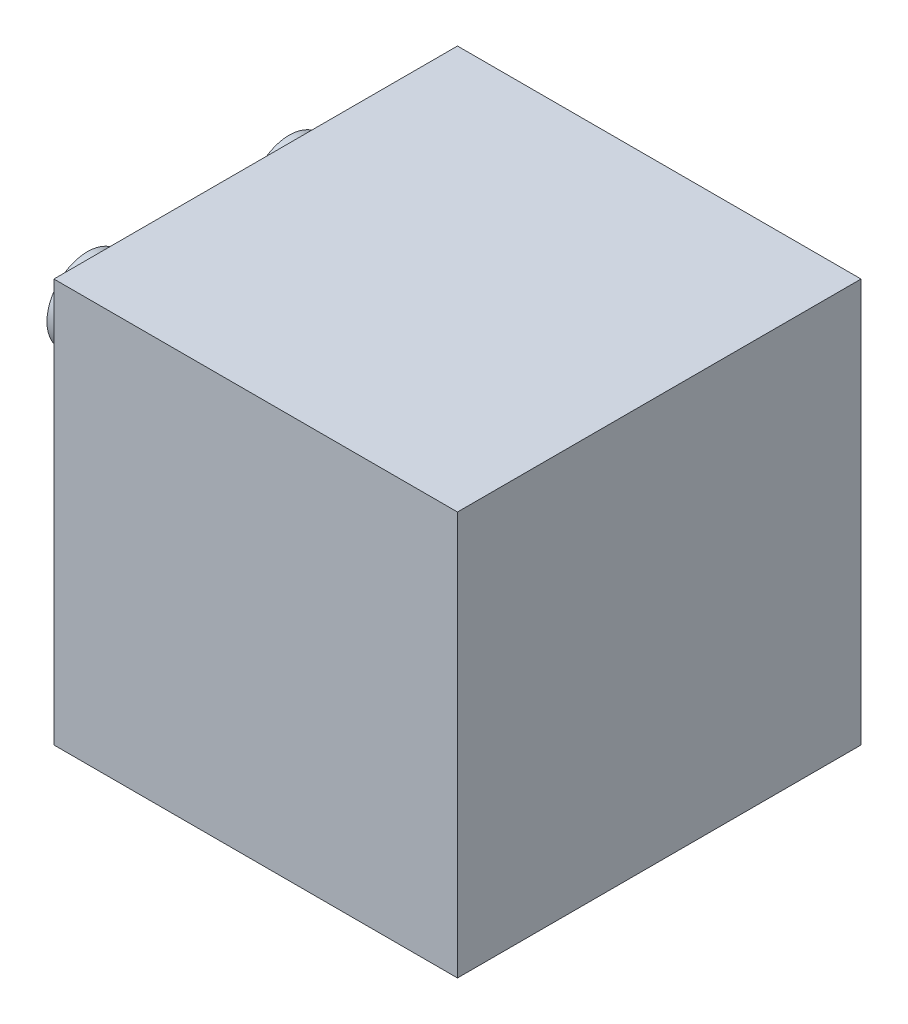
ISO-10303-21;
HEADER;
FILE_DESCRIPTION(('STEP AP214'),'2;1');
FILE_NAME('part.step','',(''),(''),'','','');
FILE_SCHEMA(('AUTOMOTIVE_DESIGN { 1 0 10303 214 1 1 1 1 }'));
ENDSEC;
DATA;
#1=APPLICATION_CONTEXT('core data for automotive mechanical design processes');
#2=APPLICATION_PROTOCOL_DEFINITION('international standard','automotive_design',2000,#1);
#3=PRODUCT_CONTEXT('',#1,'mechanical');
#4=PRODUCT('Part','Part','',(#3));
#5=PRODUCT_RELATED_PRODUCT_CATEGORY('part','',(#4));
#6=PRODUCT_DEFINITION_FORMATION('','',#4);
#7=PRODUCT_DEFINITION_CONTEXT('part definition',#1,'design');
#8=PRODUCT_DEFINITION('design','',#6,#7);
#9=PRODUCT_DEFINITION_SHAPE('','',#8);
#10=(LENGTH_UNIT() NAMED_UNIT(*) SI_UNIT(.MILLI.,.METRE.));
#11=(NAMED_UNIT(*) PLANE_ANGLE_UNIT() SI_UNIT($,.RADIAN.));
#12=(NAMED_UNIT(*) SI_UNIT($,.STERADIAN.) SOLID_ANGLE_UNIT());
#13=UNCERTAINTY_MEASURE_WITH_UNIT(LENGTH_MEASURE(1.E-05),#10,'distance_accuracy_value','');
#14=(GEOMETRIC_REPRESENTATION_CONTEXT(3) GLOBAL_UNCERTAINTY_ASSIGNED_CONTEXT((#13)) GLOBAL_UNIT_ASSIGNED_CONTEXT((#10,
#11,#12)) REPRESENTATION_CONTEXT('',''));
#15=CARTESIAN_POINT('',(0.,0.,0.));
#16=DIRECTION('',(0.,0.,1.));
#17=DIRECTION('',(1.,0.,0.));
#18=AXIS2_PLACEMENT_3D('',#15,#16,#17);
#19=CARTESIAN_POINT('',(-40.4123754328972,59.88,-7.8011231057175));
#20=DIRECTION('',(1.,0.,0.));
#21=DIRECTION('',(0.,0.,-1.));
#22=AXIS2_PLACEMENT_3D('',#19,#20,#21);
#23=PLANE('',#22);
#24=DIRECTION('',(0.,0.,-1.));
#25=VECTOR('',#24,1.);
#26=CARTESIAN_POINT('',(-40.4123754328972,35.94,20.1388768942825));
#27=LINE('',#26,#25);
#28=CARTESIAN_POINT('',(-40.4123754328972,35.94,24.1388768942825));
#29=VERTEX_POINT('',#28);
#30=CARTESIAN_POINT('',(-40.4123754328972,35.94,20.1388768942825));
#31=VERTEX_POINT('',#30);
#32=EDGE_CURVE('E202',#29,#31,#27,.T.);
#33=ORIENTED_EDGE('',*,*,#32,.F.);
#34=DIRECTION('',(0.,1.,0.));
#35=VECTOR('',#34,1.);
#36=CARTESIAN_POINT('',(-40.4123754328972,29.94,24.1388768942825));
#37=LINE('',#36,#35);
#38=CARTESIAN_POINT('',(-40.4123754328972,21.94,24.1388768942825));
#39=VERTEX_POINT('',#38);
#40=EDGE_CURVE('E212',#39,#29,#37,.T.);
#41=ORIENTED_EDGE('',*,*,#40,.F.);
#42=DIRECTION('',(0.,0.,1.));
#43=VECTOR('',#42,1.);
#44=CARTESIAN_POINT('',(-40.4123754328972,21.94,24.1388768942825));
#45=LINE('',#44,#43);
#46=CARTESIAN_POINT('',(-40.4123754328972,21.94,20.1388768942825));
#47=VERTEX_POINT('',#46);
#48=EDGE_CURVE('E221',#47,#39,#45,.T.);
#49=ORIENTED_EDGE('',*,*,#48,.F.);
#50=DIRECTION('',(0.,-1.,0.));
#51=VECTOR('',#50,1.);
#52=CARTESIAN_POINT('',(-40.4123754328972,21.94,20.1388768942825));
#53=LINE('',#52,#51);
#54=EDGE_CURVE('E83',#31,#47,#53,.T.);
#55=ORIENTED_EDGE('',*,*,#54,.F.);
#56=EDGE_LOOP('',(#33,#41,#49,#55));
#57=FACE_BOUND('',#56,.T.);
#58=CARTESIAN_POINT('',(-40.4123754328972,44.91,37.1088768942825));
#59=DIRECTION('',(1.,0.,0.));
#60=DIRECTION('',(0.,0.,-1.));
#61=AXIS2_PLACEMENT_3D('',#58,#59,#60);
#62=CIRCLE('',#61,6.);
#63=CARTESIAN_POINT('',(-40.4123754328972,44.91,31.1088768942825));
#64=VERTEX_POINT('',#63);
#65=EDGE_CURVE('E12',#64,#64,#62,.F.);
#66=ORIENTED_EDGE('',*,*,#65,.F.);
#67=EDGE_LOOP('',(#66));
#68=FACE_BOUND('',#67,.T.);
#69=CARTESIAN_POINT('',(-40.4123754328972,44.91,7.1688768942825));
#70=DIRECTION('',(1.,0.,0.));
#71=DIRECTION('',(0.,0.,-1.));
#72=AXIS2_PLACEMENT_3D('',#69,#70,#71);
#73=CIRCLE('',#72,6.);
#74=CARTESIAN_POINT('',(-40.4123754328972,44.91,1.1688768942825));
#75=VERTEX_POINT('',#74);
#76=EDGE_CURVE('E69',#75,#75,#73,.F.);
#77=ORIENTED_EDGE('',*,*,#76,.F.);
#78=EDGE_LOOP('',(#77));
#79=FACE_BOUND('',#78,.T.);
#80=DIRECTION('',(0.,0.,1.));
#81=VECTOR('',#80,1.);
#82=CARTESIAN_POINT('',(-40.4123754328972,0.,-7.8011231057175));
#83=LINE('',#82,#81);
#84=CARTESIAN_POINT('',(-40.4123754328972,0.,-7.8011231057175));
#85=VERTEX_POINT('',#84);
#86=CARTESIAN_POINT('',(-40.4123754328972,0.,52.0788768942825));
#87=VERTEX_POINT('',#86);
#88=EDGE_CURVE('E299',#85,#87,#83,.T.);
#89=ORIENTED_EDGE('',*,*,#88,.T.);
#90=DIRECTION('',(0.,-1.,0.));
#91=VECTOR('',#90,1.);
#92=CARTESIAN_POINT('',(-40.4123754328972,59.88,52.0788768942825));
#93=LINE('',#92,#91);
#94=CARTESIAN_POINT('',(-40.4123754328972,59.88,52.0788768942825));
#95=VERTEX_POINT('',#94);
#96=EDGE_CURVE('E332',#95,#87,#93,.T.);
#97=ORIENTED_EDGE('',*,*,#96,.F.);
#98=DIRECTION('',(0.,0.,1.));
#99=VECTOR('',#98,1.);
#100=CARTESIAN_POINT('',(-40.4123754328972,59.88,-7.8011231057175));
#101=LINE('',#100,#99);
#102=CARTESIAN_POINT('',(-40.4123754328972,59.88,-7.8011231057175));
#103=VERTEX_POINT('',#102);
#104=EDGE_CURVE('E306',#103,#95,#101,.T.);
#105=ORIENTED_EDGE('',*,*,#104,.F.);
#106=DIRECTION('',(0.,-1.,0.));
#107=VECTOR('',#106,1.);
#108=CARTESIAN_POINT('',(-40.4123754328972,59.88,-7.8011231057175));
#109=LINE('',#108,#107);
#110=EDGE_CURVE('E316',#103,#85,#109,.T.);
#111=ORIENTED_EDGE('',*,*,#110,.T.);
#112=EDGE_LOOP('',(#89,#97,#105,#111));
#113=FACE_BOUND('',#112,.T.);
#114=CARTESIAN_POINT('',(-40.4123754328972,15.0328473225194,11.1995581186024));
#115=CARTESIAN_POINT('',(-40.4123754328972,2.88078542754067,22.0189662727186));
#116=CARTESIAN_POINT('',(-40.4123754328972,15.0328473225194,32.6103832399784));
#117=B_SPLINE_CURVE_WITH_KNOTS('',2,(#114,#115,#116),.UNSPECIFIED.,.F.,.F.,(3,3),(0.,1.),.UNSPECIFIED.);
#118=CARTESIAN_POINT('',(-40.4123754328972,15.0328473225194,11.1995581186024));
#119=VERTEX_POINT('',#118);
#120=CARTESIAN_POINT('',(-40.4123754328972,15.0328473225194,32.6103832399784));
#121=VERTEX_POINT('',#120);
#122=EDGE_CURVE('E201',#119,#121,#117,.T.);
#123=ORIENTED_EDGE('',*,*,#122,.F.);
#124=DIRECTION('',(0.,0.,-1.));
#125=VECTOR('',#124,1.);
#126=CARTESIAN_POINT('',(-40.4123754328972,15.0328473225194,11.1995581186024));
#127=LINE('',#126,#125);
#128=EDGE_CURVE('E75',#121,#119,#127,.T.);
#129=ORIENTED_EDGE('',*,*,#128,.F.);
#130=EDGE_LOOP('',(#123,#129));
#131=FACE_BOUND('',#130,.T.);
#132=ADVANCED_FACE('F62',(#57,#68,#79,#113,#131),#23,.F.);
#133=CARTESIAN_POINT('',(0.,0.,0.));
#134=DIRECTION('',(0.,1.,0.));
#135=DIRECTION('',(0.,0.,1.));
#136=AXIS2_PLACEMENT_3D('',#133,#134,#135);
#137=PLANE('',#136);
#138=ORIENTED_EDGE('',*,*,#88,.F.);
#139=DIRECTION('',(-1.,0.,0.));
#140=VECTOR('',#139,1.);
#141=CARTESIAN_POINT('',(-40.4123754328972,0.,-7.8011231057175));
#142=LINE('',#141,#140);
#143=CARTESIAN_POINT('',(19.4676245671028,0.,-7.8011231057175));
#144=VERTEX_POINT('',#143);
#145=EDGE_CURVE('E310',#144,#85,#142,.T.);
#146=ORIENTED_EDGE('',*,*,#145,.F.);
#147=DIRECTION('',(0.,0.,-1.));
#148=VECTOR('',#147,1.);
#149=CARTESIAN_POINT('',(19.4676245671028,0.,-7.8011231057175));
#150=LINE('',#149,#148);
#151=CARTESIAN_POINT('',(19.4676245671028,0.,52.0788768942825));
#152=VERTEX_POINT('',#151);
#153=EDGE_CURVE('E321',#152,#144,#150,.T.);
#154=ORIENTED_EDGE('',*,*,#153,.F.);
#155=DIRECTION('',(1.,0.,0.));
#156=VECTOR('',#155,1.);
#157=CARTESIAN_POINT('',(-40.4123754328972,0.,52.0788768942825));
#158=LINE('',#157,#156);
#159=EDGE_CURVE('E319',#87,#152,#158,.T.);
#160=ORIENTED_EDGE('',*,*,#159,.F.);
#161=EDGE_LOOP('',(#138,#146,#154,#160));
#162=FACE_BOUND('',#161,.T.);
#163=DIRECTION('',(0.,0.,-1.));
#164=VECTOR('',#163,1.);
#165=CARTESIAN_POINT('',(-11.9723754328972,0.,0.));
#166=LINE('',#165,#164);
#167=CARTESIAN_POINT('',(-11.9723754328972,0.,12.1688768942825));
#168=VERTEX_POINT('',#167);
#169=CARTESIAN_POINT('',(-11.9723754328972,0.,2.1688768942825));
#170=VERTEX_POINT('',#169);
#171=EDGE_CURVE('E289',#168,#170,#166,.T.);
#172=ORIENTED_EDGE('',*,*,#171,.F.);
#173=DIRECTION('',(-1.,0.,0.));
#174=VECTOR('',#173,1.);
#175=CARTESIAN_POINT('',(0.,0.,12.1688768942825));
#176=LINE('',#175,#174);
#177=CARTESIAN_POINT('',(-8.97237543289719,0.,12.1688768942825));
#178=VERTEX_POINT('',#177);
#179=EDGE_CURVE('E267',#178,#168,#176,.T.);
#180=ORIENTED_EDGE('',*,*,#179,.F.);
#181=DIRECTION('',(0.,0.,1.));
#182=VECTOR('',#181,1.);
#183=CARTESIAN_POINT('',(-8.97237543289719,0.,0.));
#184=LINE('',#183,#182);
#185=CARTESIAN_POINT('',(-8.97237543289719,0.,2.1688768942825));
#186=VERTEX_POINT('',#185);
#187=EDGE_CURVE('E279',#186,#178,#184,.T.);
#188=ORIENTED_EDGE('',*,*,#187,.F.);
#189=DIRECTION('',(-1.,0.,0.));
#190=VECTOR('',#189,1.);
#191=CARTESIAN_POINT('',(0.,0.,2.1688768942825));
#192=LINE('',#191,#190);
#193=EDGE_CURVE('E292',#186,#170,#192,.T.);
#194=ORIENTED_EDGE('',*,*,#193,.T.);
#195=EDGE_LOOP('',(#172,#180,#188,#194));
#196=FACE_BOUND('',#195,.T.);
#197=DIRECTION('',(-1.,0.,0.));
#198=VECTOR('',#197,1.);
#199=CARTESIAN_POINT('',(0.,0.,32.1088768942825));
#200=LINE('',#199,#198);
#201=CARTESIAN_POINT('',(-8.97237543289719,0.,32.1088768942825));
#202=VERTEX_POINT('',#201);
#203=CARTESIAN_POINT('',(-11.9723754328972,0.,32.1088768942825));
#204=VERTEX_POINT('',#203);
#205=EDGE_CURVE('E264',#202,#204,#200,.T.);
#206=ORIENTED_EDGE('',*,*,#205,.T.);
#207=DIRECTION('',(0.,0.,1.));
#208=VECTOR('',#207,1.);
#209=CARTESIAN_POINT('',(-11.9723754328972,0.,0.));
#210=LINE('',#209,#208);
#211=CARTESIAN_POINT('',(-11.9723754328972,0.,42.1088768942825));
#212=VERTEX_POINT('',#211);
#213=EDGE_CURVE('E254',#204,#212,#210,.T.);
#214=ORIENTED_EDGE('',*,*,#213,.T.);
#215=DIRECTION('',(1.,0.,0.));
#216=VECTOR('',#215,1.);
#217=CARTESIAN_POINT('',(0.,0.,42.1088768942825));
#218=LINE('',#217,#216);
#219=CARTESIAN_POINT('',(-8.97237543289719,0.,42.1088768942825));
#220=VERTEX_POINT('',#219);
#221=EDGE_CURVE('E257',#212,#220,#218,.T.);
#222=ORIENTED_EDGE('',*,*,#221,.T.);
#223=DIRECTION('',(0.,0.,-1.));
#224=VECTOR('',#223,1.);
#225=CARTESIAN_POINT('',(-8.97237543289719,0.,0.));
#226=LINE('',#225,#224);
#227=EDGE_CURVE('E261',#220,#202,#226,.T.);
#228=ORIENTED_EDGE('',*,*,#227,.T.);
#229=EDGE_LOOP('',(#206,#214,#222,#228));
#230=FACE_BOUND('',#229,.T.);
#231=ADVANCED_FACE('F341',(#162,#196,#230),#137,.F.);
#232=CARTESIAN_POINT('',(-40.4123754328972,59.88,52.0788768942825));
#233=DIRECTION('',(0.,0.,-1.));
#234=DIRECTION('',(-1.,0.,0.));
#235=AXIS2_PLACEMENT_3D('',#232,#233,#234);
#236=PLANE('',#235);
#237=ORIENTED_EDGE('',*,*,#159,.T.);
#238=DIRECTION('',(0.,-1.,0.));
#239=VECTOR('',#238,1.);
#240=CARTESIAN_POINT('',(19.4676245671028,59.88,52.0788768942825));
#241=LINE('',#240,#239);
#242=CARTESIAN_POINT('',(19.4676245671028,59.88,52.0788768942825));
#243=VERTEX_POINT('',#242);
#244=EDGE_CURVE('E329',#243,#152,#241,.T.);
#245=ORIENTED_EDGE('',*,*,#244,.F.);
#246=DIRECTION('',(1.,0.,0.));
#247=VECTOR('',#246,1.);
#248=CARTESIAN_POINT('',(-40.4123754328972,59.88,52.0788768942825));
#249=LINE('',#248,#247);
#250=EDGE_CURVE('E309',#95,#243,#249,.T.);
#251=ORIENTED_EDGE('',*,*,#250,.F.);
#252=ORIENTED_EDGE('',*,*,#96,.T.);
#253=EDGE_LOOP('',(#237,#245,#251,#252));
#254=FACE_BOUND('',#253,.T.);
#255=ADVANCED_FACE('F443',(#254),#236,.F.);
#256=CARTESIAN_POINT('',(19.4676245671028,59.88,-7.8011231057175));
#257=DIRECTION('',(-1.,0.,0.));
#258=DIRECTION('',(0.,0.,1.));
#259=AXIS2_PLACEMENT_3D('',#256,#257,#258);
#260=PLANE('',#259);
#261=ORIENTED_EDGE('',*,*,#153,.T.);
#262=DIRECTION('',(0.,-1.,0.));
#263=VECTOR('',#262,1.);
#264=CARTESIAN_POINT('',(19.4676245671028,59.88,-7.8011231057175));
#265=LINE('',#264,#263);
#266=CARTESIAN_POINT('',(19.4676245671028,59.88,-7.8011231057175));
#267=VERTEX_POINT('',#266);
#268=EDGE_CURVE('E326',#267,#144,#265,.T.);
#269=ORIENTED_EDGE('',*,*,#268,.F.);
#270=DIRECTION('',(0.,0.,-1.));
#271=VECTOR('',#270,1.);
#272=CARTESIAN_POINT('',(19.4676245671028,59.88,-7.8011231057175));
#273=LINE('',#272,#271);
#274=EDGE_CURVE('E312',#243,#267,#273,.T.);
#275=ORIENTED_EDGE('',*,*,#274,.F.);
#276=ORIENTED_EDGE('',*,*,#244,.T.);
#277=EDGE_LOOP('',(#261,#269,#275,#276));
#278=FACE_BOUND('',#277,.T.);
#279=ADVANCED_FACE('F447',(#278),#260,.F.);
#280=CARTESIAN_POINT('',(-40.4123754328972,59.88,-7.8011231057175));
#281=DIRECTION('',(0.,0.,1.));
#282=DIRECTION('',(1.,0.,0.));
#283=AXIS2_PLACEMENT_3D('',#280,#281,#282);
#284=PLANE('',#283);
#285=ORIENTED_EDGE('',*,*,#145,.T.);
#286=ORIENTED_EDGE('',*,*,#110,.F.);
#287=DIRECTION('',(-1.,0.,0.));
#288=VECTOR('',#287,1.);
#289=CARTESIAN_POINT('',(-40.4123754328972,59.88,-7.8011231057175));
#290=LINE('',#289,#288);
#291=EDGE_CURVE('E314',#267,#103,#290,.T.);
#292=ORIENTED_EDGE('',*,*,#291,.F.);
#293=ORIENTED_EDGE('',*,*,#268,.T.);
#294=EDGE_LOOP('',(#285,#286,#292,#293));
#295=FACE_BOUND('',#294,.T.);
#296=ADVANCED_FACE('F439',(#295),#284,.F.);
#297=CARTESIAN_POINT('',(0.,59.88,0.));
#298=DIRECTION('',(0.,1.,0.));
#299=DIRECTION('',(0.,0.,1.));
#300=AXIS2_PLACEMENT_3D('',#297,#298,#299);
#301=PLANE('',#300);
#302=ORIENTED_EDGE('',*,*,#104,.T.);
#303=ORIENTED_EDGE('',*,*,#250,.T.);
#304=ORIENTED_EDGE('',*,*,#274,.T.);
#305=ORIENTED_EDGE('',*,*,#291,.T.);
#306=EDGE_LOOP('',(#302,#303,#304,#305));
#307=FACE_BOUND('',#306,.T.);
#308=ADVANCED_FACE('F435',(#307),#301,.T.);
#309=CARTESIAN_POINT('',(0.,30.,12.1688768942825));
#310=DIRECTION('',(0.,0.,1.));
#311=DIRECTION('',(1.,0.,0.));
#312=AXIS2_PLACEMENT_3D('',#309,#310,#311);
#313=PLANE('',#312);
#314=ORIENTED_EDGE('',*,*,#179,.T.);
#315=DIRECTION('',(0.,-1.,0.));
#316=VECTOR('',#315,1.);
#317=CARTESIAN_POINT('',(-11.9723754328972,30.,12.1688768942825));
#318=LINE('',#317,#316);
#319=CARTESIAN_POINT('',(-11.9723754328972,30.,12.1688768942825));
#320=VERTEX_POINT('',#319);
#321=EDGE_CURVE('E287',#320,#168,#318,.T.);
#322=ORIENTED_EDGE('',*,*,#321,.F.);
#323=DIRECTION('',(-1.,0.,0.));
#324=VECTOR('',#323,1.);
#325=CARTESIAN_POINT('',(0.,30.,12.1688768942825));
#326=LINE('',#325,#324);
#327=CARTESIAN_POINT('',(-8.97237543289719,30.,12.1688768942825));
#328=VERTEX_POINT('',#327);
#329=EDGE_CURVE('E275',#328,#320,#326,.T.);
#330=ORIENTED_EDGE('',*,*,#329,.F.);
#331=DIRECTION('',(0.,-1.,0.));
#332=VECTOR('',#331,1.);
#333=CARTESIAN_POINT('',(-8.97237543289719,30.,12.1688768942825));
#334=LINE('',#333,#332);
#335=EDGE_CURVE('E297',#328,#178,#334,.T.);
#336=ORIENTED_EDGE('',*,*,#335,.T.);
#337=EDGE_LOOP('',(#314,#322,#330,#336));
#338=FACE_BOUND('',#337,.T.);
#339=ADVANCED_FACE('F425',(#338),#313,.F.);
#340=CARTESIAN_POINT('',(-8.97237543289719,30.,0.));
#341=DIRECTION('',(1.,0.,0.));
#342=DIRECTION('',(0.,0.,-1.));
#343=AXIS2_PLACEMENT_3D('',#340,#341,#342);
#344=PLANE('',#343);
#345=ORIENTED_EDGE('',*,*,#187,.T.);
#346=ORIENTED_EDGE('',*,*,#335,.F.);
#347=DIRECTION('',(0.,0.,1.));
#348=VECTOR('',#347,1.);
#349=CARTESIAN_POINT('',(-8.97237543289719,30.,0.));
#350=LINE('',#349,#348);
#351=CARTESIAN_POINT('',(-8.97237543289719,30.,2.1688768942825));
#352=VERTEX_POINT('',#351);
#353=EDGE_CURVE('E284',#352,#328,#350,.T.);
#354=ORIENTED_EDGE('',*,*,#353,.F.);
#355=DIRECTION('',(0.,-1.,0.));
#356=VECTOR('',#355,1.);
#357=CARTESIAN_POINT('',(-8.97237543289719,30.,2.1688768942825));
#358=LINE('',#357,#356);
#359=EDGE_CURVE('E300',#352,#186,#358,.T.);
#360=ORIENTED_EDGE('',*,*,#359,.T.);
#361=EDGE_LOOP('',(#345,#346,#354,#360));
#362=FACE_BOUND('',#361,.T.);
#363=ADVANCED_FACE('F421',(#362),#344,.F.);
#364=CARTESIAN_POINT('',(0.,30.,2.1688768942825));
#365=DIRECTION('',(0.,0.,1.));
#366=DIRECTION('',(1.,0.,0.));
#367=AXIS2_PLACEMENT_3D('',#364,#365,#366);
#368=PLANE('',#367);
#369=ORIENTED_EDGE('',*,*,#193,.F.);
#370=ORIENTED_EDGE('',*,*,#359,.F.);
#371=DIRECTION('',(-1.,0.,0.));
#372=VECTOR('',#371,1.);
#373=CARTESIAN_POINT('',(0.,30.,2.1688768942825));
#374=LINE('',#373,#372);
#375=CARTESIAN_POINT('',(-11.9723754328972,30.,2.1688768942825));
#376=VERTEX_POINT('',#375);
#377=EDGE_CURVE('E282',#352,#376,#374,.T.);
#378=ORIENTED_EDGE('',*,*,#377,.T.);
#379=DIRECTION('',(0.,-1.,0.));
#380=VECTOR('',#379,1.);
#381=CARTESIAN_POINT('',(-11.9723754328972,30.,2.1688768942825));
#382=LINE('',#381,#380);
#383=EDGE_CURVE('E302',#376,#170,#382,.T.);
#384=ORIENTED_EDGE('',*,*,#383,.T.);
#385=EDGE_LOOP('',(#369,#370,#378,#384));
#386=FACE_BOUND('',#385,.T.);
#387=ADVANCED_FACE('F424',(#386),#368,.T.);
#388=CARTESIAN_POINT('',(-11.9723754328972,30.,0.));
#389=DIRECTION('',(-1.,0.,0.));
#390=DIRECTION('',(0.,0.,1.));
#391=AXIS2_PLACEMENT_3D('',#388,#389,#390);
#392=PLANE('',#391);
#393=ORIENTED_EDGE('',*,*,#171,.T.);
#394=ORIENTED_EDGE('',*,*,#383,.F.);
#395=DIRECTION('',(0.,0.,-1.));
#396=VECTOR('',#395,1.);
#397=CARTESIAN_POINT('',(-11.9723754328972,30.,0.));
#398=LINE('',#397,#396);
#399=EDGE_CURVE('E278',#320,#376,#398,.T.);
#400=ORIENTED_EDGE('',*,*,#399,.F.);
#401=ORIENTED_EDGE('',*,*,#321,.T.);
#402=EDGE_LOOP('',(#393,#394,#400,#401));
#403=FACE_BOUND('',#402,.T.);
#404=ADVANCED_FACE('F419',(#403),#392,.F.);
#405=CARTESIAN_POINT('',(0.,30.,0.));
#406=DIRECTION('',(0.,-1.,0.));
#407=DIRECTION('',(0.,0.,-1.));
#408=AXIS2_PLACEMENT_3D('',#405,#406,#407);
#409=PLANE('',#408);
#410=ORIENTED_EDGE('',*,*,#329,.T.);
#411=ORIENTED_EDGE('',*,*,#399,.T.);
#412=ORIENTED_EDGE('',*,*,#377,.F.);
#413=ORIENTED_EDGE('',*,*,#353,.T.);
#414=EDGE_LOOP('',(#410,#411,#412,#413));
#415=FACE_BOUND('',#414,.T.);
#416=ADVANCED_FACE('F401',(#415),#409,.T.);
#417=CARTESIAN_POINT('',(0.,30.,32.1088768942825));
#418=DIRECTION('',(0.,0.,1.));
#419=DIRECTION('',(1.,0.,0.));
#420=AXIS2_PLACEMENT_3D('',#417,#418,#419);
#421=PLANE('',#420);
#422=ORIENTED_EDGE('',*,*,#205,.F.);
#423=DIRECTION('',(0.,-1.,0.));
#424=VECTOR('',#423,1.);
#425=CARTESIAN_POINT('',(-8.97237543289719,30.,32.1088768942825));
#426=LINE('',#425,#424);
#427=CARTESIAN_POINT('',(-8.97237543289719,30.,32.1088768942825));
#428=VERTEX_POINT('',#427);
#429=EDGE_CURVE('E244',#428,#202,#426,.T.);
#430=ORIENTED_EDGE('',*,*,#429,.F.);
#431=DIRECTION('',(-1.,0.,0.));
#432=VECTOR('',#431,1.);
#433=CARTESIAN_POINT('',(0.,30.,32.1088768942825));
#434=LINE('',#433,#432);
#435=CARTESIAN_POINT('',(-11.9723754328972,30.,32.1088768942825));
#436=VERTEX_POINT('',#435);
#437=EDGE_CURVE('E258',#428,#436,#434,.T.);
#438=ORIENTED_EDGE('',*,*,#437,.T.);
#439=DIRECTION('',(0.,-1.,0.));
#440=VECTOR('',#439,1.);
#441=CARTESIAN_POINT('',(-11.9723754328972,30.,32.1088768942825));
#442=LINE('',#441,#440);
#443=EDGE_CURVE('E243',#436,#204,#442,.T.);
#444=ORIENTED_EDGE('',*,*,#443,.T.);
#445=EDGE_LOOP('',(#422,#430,#438,#444));
#446=FACE_BOUND('',#445,.T.);
#447=ADVANCED_FACE('F397',(#446),#421,.T.);
#448=CARTESIAN_POINT('',(-8.97237543289719,30.,0.));
#449=DIRECTION('',(-1.,0.,0.));
#450=DIRECTION('',(0.,0.,1.));
#451=AXIS2_PLACEMENT_3D('',#448,#449,#450);
#452=PLANE('',#451);
#453=ORIENTED_EDGE('',*,*,#227,.F.);
#454=DIRECTION('',(0.,-1.,0.));
#455=VECTOR('',#454,1.);
#456=CARTESIAN_POINT('',(-8.97237543289719,30.,42.1088768942825));
#457=LINE('',#456,#455);
#458=CARTESIAN_POINT('',(-8.97237543289719,30.,42.1088768942825));
#459=VERTEX_POINT('',#458);
#460=EDGE_CURVE('E247',#459,#220,#457,.T.);
#461=ORIENTED_EDGE('',*,*,#460,.F.);
#462=DIRECTION('',(0.,0.,-1.));
#463=VECTOR('',#462,1.);
#464=CARTESIAN_POINT('',(-8.97237543289719,30.,0.));
#465=LINE('',#464,#463);
#466=EDGE_CURVE('E271',#459,#428,#465,.T.);
#467=ORIENTED_EDGE('',*,*,#466,.T.);
#468=ORIENTED_EDGE('',*,*,#429,.T.);
#469=EDGE_LOOP('',(#453,#461,#467,#468));
#470=FACE_BOUND('',#469,.T.);
#471=ADVANCED_FACE('F400',(#470),#452,.T.);
#472=CARTESIAN_POINT('',(0.,30.,42.1088768942825));
#473=DIRECTION('',(0.,0.,-1.));
#474=DIRECTION('',(-1.,0.,0.));
#475=AXIS2_PLACEMENT_3D('',#472,#473,#474);
#476=PLANE('',#475);
#477=ORIENTED_EDGE('',*,*,#221,.F.);
#478=DIRECTION('',(0.,-1.,0.));
#479=VECTOR('',#478,1.);
#480=CARTESIAN_POINT('',(-11.9723754328972,30.,42.1088768942825));
#481=LINE('',#480,#479);
#482=CARTESIAN_POINT('',(-11.9723754328972,30.,42.1088768942825));
#483=VERTEX_POINT('',#482);
#484=EDGE_CURVE('E249',#483,#212,#481,.T.);
#485=ORIENTED_EDGE('',*,*,#484,.F.);
#486=DIRECTION('',(1.,0.,0.));
#487=VECTOR('',#486,1.);
#488=CARTESIAN_POINT('',(0.,30.,42.1088768942825));
#489=LINE('',#488,#487);
#490=EDGE_CURVE('E269',#483,#459,#489,.T.);
#491=ORIENTED_EDGE('',*,*,#490,.T.);
#492=ORIENTED_EDGE('',*,*,#460,.T.);
#493=EDGE_LOOP('',(#477,#485,#491,#492));
#494=FACE_BOUND('',#493,.T.);
#495=ADVANCED_FACE('F405',(#494),#476,.T.);
#496=CARTESIAN_POINT('',(-11.9723754328972,30.,0.));
#497=DIRECTION('',(1.,0.,0.));
#498=DIRECTION('',(0.,0.,-1.));
#499=AXIS2_PLACEMENT_3D('',#496,#497,#498);
#500=PLANE('',#499);
#501=ORIENTED_EDGE('',*,*,#213,.F.);
#502=ORIENTED_EDGE('',*,*,#443,.F.);
#503=DIRECTION('',(0.,0.,1.));
#504=VECTOR('',#503,1.);
#505=CARTESIAN_POINT('',(-11.9723754328972,30.,0.));
#506=LINE('',#505,#504);
#507=EDGE_CURVE('E246',#436,#483,#506,.T.);
#508=ORIENTED_EDGE('',*,*,#507,.T.);
#509=ORIENTED_EDGE('',*,*,#484,.T.);
#510=EDGE_LOOP('',(#501,#502,#508,#509));
#511=FACE_BOUND('',#510,.T.);
#512=ADVANCED_FACE('F409',(#511),#500,.T.);
#513=CARTESIAN_POINT('',(0.,30.,0.));
#514=DIRECTION('',(0.,-1.,0.));
#515=DIRECTION('',(0.,0.,-1.));
#516=AXIS2_PLACEMENT_3D('',#513,#514,#515);
#517=PLANE('',#516);
#518=ORIENTED_EDGE('',*,*,#437,.F.);
#519=ORIENTED_EDGE('',*,*,#466,.F.);
#520=ORIENTED_EDGE('',*,*,#490,.F.);
#521=ORIENTED_EDGE('',*,*,#507,.F.);
#522=EDGE_LOOP('',(#518,#519,#520,#521));
#523=FACE_BOUND('',#522,.T.);
#524=ADVANCED_FACE('F395',(#523),#517,.T.);
#525=CARTESIAN_POINT('',(-50.4123754328972,44.91,7.1688768942825));
#526=DIRECTION('',(1.,0.,0.));
#527=DIRECTION('',(0.,0.,-1.));
#528=AXIS2_PLACEMENT_3D('',#525,#526,#527);
#529=CYLINDRICAL_SURFACE('',#528,6.);
#530=CARTESIAN_POINT('',(-50.4123754328972,44.91,7.1688768942825));
#531=DIRECTION('',(-1.,0.,0.));
#532=DIRECTION('',(0.,0.,1.));
#533=AXIS2_PLACEMENT_3D('',#530,#531,#532);
#534=CIRCLE('',#533,6.);
#535=CARTESIAN_POINT('',(-50.4123754328972,44.91,13.1688768942825));
#536=VERTEX_POINT('',#535);
#537=EDGE_CURVE('E240',#536,#536,#534,.T.);
#538=ORIENTED_EDGE('',*,*,#537,.F.);
#539=EDGE_LOOP('',(#538));
#540=FACE_BOUND('',#539,.T.);
#541=ORIENTED_EDGE('',*,*,#76,.T.);
#542=EDGE_LOOP('',(#541));
#543=FACE_BOUND('',#542,.T.);
#544=ADVANCED_FACE('F337',(#540,#543),#529,.T.);
#545=CARTESIAN_POINT('',(-50.4123754328972,44.91,7.1688768942825));
#546=DIRECTION('',(-1.,0.,0.));
#547=DIRECTION('',(0.,0.,1.));
#548=AXIS2_PLACEMENT_3D('',#545,#546,#547);
#549=PLANE('',#548);
#550=ORIENTED_EDGE('',*,*,#537,.T.);
#551=EDGE_LOOP('',(#550));
#552=FACE_BOUND('',#551,.T.);
#553=ADVANCED_FACE('F388',(#552),#549,.T.);
#554=CARTESIAN_POINT('',(-50.4123754328972,44.91,37.1088768942825));
#555=DIRECTION('',(1.,0.,0.));
#556=DIRECTION('',(0.,0.,-1.));
#557=AXIS2_PLACEMENT_3D('',#554,#555,#556);
#558=CYLINDRICAL_SURFACE('',#557,6.);
#559=CARTESIAN_POINT('',(-50.4123754328972,44.91,37.1088768942825));
#560=DIRECTION('',(-1.,0.,0.));
#561=DIRECTION('',(0.,0.,1.));
#562=AXIS2_PLACEMENT_3D('',#559,#560,#561);
#563=CIRCLE('',#562,6.);
#564=CARTESIAN_POINT('',(-50.4123754328972,44.91,43.1088768942825));
#565=VERTEX_POINT('',#564);
#566=EDGE_CURVE('E237',#565,#565,#563,.T.);
#567=ORIENTED_EDGE('',*,*,#566,.F.);
#568=EDGE_LOOP('',(#567));
#569=FACE_BOUND('',#568,.T.);
#570=ORIENTED_EDGE('',*,*,#65,.T.);
#571=EDGE_LOOP('',(#570));
#572=FACE_BOUND('',#571,.T.);
#573=ADVANCED_FACE('F384',(#569,#572),#558,.T.);
#574=CARTESIAN_POINT('',(-50.4123754328972,44.91,37.1088768942825));
#575=DIRECTION('',(-1.,0.,0.));
#576=DIRECTION('',(0.,0.,1.));
#577=AXIS2_PLACEMENT_3D('',#574,#575,#576);
#578=PLANE('',#577);
#579=ORIENTED_EDGE('',*,*,#566,.T.);
#580=EDGE_LOOP('',(#579));
#581=FACE_BOUND('',#580,.T.);
#582=ADVANCED_FACE('F380',(#581),#578,.T.);
#583=CARTESIAN_POINT('',(-50.4123754328972,35.94,20.1388768942825));
#584=DIRECTION('',(0.,-1.,0.));
#585=DIRECTION('',(0.,0.,-1.));
#586=AXIS2_PLACEMENT_3D('',#583,#584,#585);
#587=PLANE('',#586);
#588=ORIENTED_EDGE('',*,*,#32,.T.);
#589=DIRECTION('',(1.,0.,0.));
#590=VECTOR('',#589,1.);
#591=CARTESIAN_POINT('',(-50.4123754328972,35.94,20.1388768942825));
#592=LINE('',#591,#590);
#593=CARTESIAN_POINT('',(-50.4123754328972,35.94,20.1388768942825));
#594=VERTEX_POINT('',#593);
#595=EDGE_CURVE('E231',#594,#31,#592,.T.);
#596=ORIENTED_EDGE('',*,*,#595,.F.);
#597=DIRECTION('',(0.,0.,-1.));
#598=VECTOR('',#597,1.);
#599=CARTESIAN_POINT('',(-50.4123754328972,35.94,20.1388768942825));
#600=LINE('',#599,#598);
#601=CARTESIAN_POINT('',(-50.4123754328972,35.94,24.1388768942825));
#602=VERTEX_POINT('',#601);
#603=EDGE_CURVE('E211',#602,#594,#600,.T.);
#604=ORIENTED_EDGE('',*,*,#603,.F.);
#605=DIRECTION('',(1.,0.,0.));
#606=VECTOR('',#605,1.);
#607=CARTESIAN_POINT('',(-50.4123754328972,35.94,24.1388768942825));
#608=LINE('',#607,#606);
#609=EDGE_CURVE('E234',#602,#29,#608,.T.);
#610=ORIENTED_EDGE('',*,*,#609,.T.);
#611=EDGE_LOOP('',(#588,#596,#604,#610));
#612=FACE_BOUND('',#611,.T.);
#613=ADVANCED_FACE('F376',(#612),#587,.F.);
#614=CARTESIAN_POINT('',(-50.4123754328972,21.94,20.1388768942825));
#615=DIRECTION('',(0.,0.,1.));
#616=DIRECTION('',(1.,0.,0.));
#617=AXIS2_PLACEMENT_3D('',#614,#615,#616);
#618=PLANE('',#617);
#619=ORIENTED_EDGE('',*,*,#54,.T.);
#620=DIRECTION('',(1.,0.,0.));
#621=VECTOR('',#620,1.);
#622=CARTESIAN_POINT('',(-50.4123754328972,21.94,20.1388768942825));
#623=LINE('',#622,#621);
#624=CARTESIAN_POINT('',(-50.4123754328972,21.94,20.1388768942825));
#625=VERTEX_POINT('',#624);
#626=EDGE_CURVE('E228',#625,#47,#623,.T.);
#627=ORIENTED_EDGE('',*,*,#626,.F.);
#628=DIRECTION('',(0.,-1.,0.));
#629=VECTOR('',#628,1.);
#630=CARTESIAN_POINT('',(-50.4123754328972,21.94,20.1388768942825));
#631=LINE('',#630,#629);
#632=EDGE_CURVE('E214',#594,#625,#631,.T.);
#633=ORIENTED_EDGE('',*,*,#632,.F.);
#634=ORIENTED_EDGE('',*,*,#595,.T.);
#635=EDGE_LOOP('',(#619,#627,#633,#634));
#636=FACE_BOUND('',#635,.T.);
#637=ADVANCED_FACE('F372',(#636),#618,.F.);
#638=CARTESIAN_POINT('',(-50.4123754328972,21.94,24.1388768942825));
#639=DIRECTION('',(0.,1.,0.));
#640=DIRECTION('',(0.,0.,1.));
#641=AXIS2_PLACEMENT_3D('',#638,#639,#640);
#642=PLANE('',#641);
#643=ORIENTED_EDGE('',*,*,#48,.T.);
#644=DIRECTION('',(1.,0.,0.));
#645=VECTOR('',#644,1.);
#646=CARTESIAN_POINT('',(-50.4123754328972,21.94,24.1388768942825));
#647=LINE('',#646,#645);
#648=CARTESIAN_POINT('',(-50.4123754328972,21.94,24.1388768942825));
#649=VERTEX_POINT('',#648);
#650=EDGE_CURVE('E218',#649,#39,#647,.T.);
#651=ORIENTED_EDGE('',*,*,#650,.F.);
#652=DIRECTION('',(0.,0.,1.));
#653=VECTOR('',#652,1.);
#654=CARTESIAN_POINT('',(-50.4123754328972,21.94,24.1388768942825));
#655=LINE('',#654,#653);
#656=EDGE_CURVE('E216',#625,#649,#655,.T.);
#657=ORIENTED_EDGE('',*,*,#656,.F.);
#658=ORIENTED_EDGE('',*,*,#626,.T.);
#659=EDGE_LOOP('',(#643,#651,#657,#658));
#660=FACE_BOUND('',#659,.T.);
#661=ADVANCED_FACE('F368',(#660),#642,.F.);
#662=CARTESIAN_POINT('',(-50.4123754328972,29.94,24.1388768942825));
#663=DIRECTION('',(0.,0.,-1.));
#664=DIRECTION('',(0.,1.,0.));
#665=AXIS2_PLACEMENT_3D('',#662,#663,#664);
#666=PLANE('',#665);
#667=ORIENTED_EDGE('',*,*,#40,.T.);
#668=ORIENTED_EDGE('',*,*,#609,.F.);
#669=DIRECTION('',(0.,1.,0.));
#670=VECTOR('',#669,1.);
#671=CARTESIAN_POINT('',(-50.4123754328972,35.94,24.1388768942825));
#672=LINE('',#671,#670);
#673=EDGE_CURVE('E208',#649,#602,#672,.T.);
#674=ORIENTED_EDGE('',*,*,#673,.F.);
#675=ORIENTED_EDGE('',*,*,#650,.T.);
#676=EDGE_LOOP('',(#667,#668,#674,#675));
#677=FACE_BOUND('',#676,.T.);
#678=ADVANCED_FACE('F364',(#677),#666,.F.);
#679=CARTESIAN_POINT('',(-50.4123754328972,0.,0.));
#680=DIRECTION('',(1.,0.,0.));
#681=DIRECTION('',(0.,0.,-1.));
#682=AXIS2_PLACEMENT_3D('',#679,#680,#681);
#683=PLANE('',#682);
#684=ORIENTED_EDGE('',*,*,#673,.T.);
#685=ORIENTED_EDGE('',*,*,#603,.T.);
#686=ORIENTED_EDGE('',*,*,#632,.T.);
#687=ORIENTED_EDGE('',*,*,#656,.T.);
#688=EDGE_LOOP('',(#684,#685,#686,#687));
#689=FACE_BOUND('',#688,.T.);
#690=ADVANCED_FACE('F360',(#689),#683,.F.);
#691=CARTESIAN_POINT('',(-50.4123754328972,15.0328473225194,11.1995581186024));
#692=CARTESIAN_POINT('',(-50.4123754328972,2.88078542754067,22.0189662727186));
#693=CARTESIAN_POINT('',(-50.4123754328972,15.0328473225194,32.6103832399784));
#694=B_SPLINE_CURVE_WITH_KNOTS('',2,(#691,#692,#693),.UNSPECIFIED.,.F.,.F.,(3,3),(0.,1.),.UNSPECIFIED.);
#695=DIRECTION('',(1.,0.,0.));
#696=VECTOR('',#695,1.);
#697=SURFACE_OF_LINEAR_EXTRUSION('',#694,#696);
#698=ORIENTED_EDGE('',*,*,#122,.T.);
#699=DIRECTION('',(1.,0.,0.));
#700=VECTOR('',#699,1.);
#701=CARTESIAN_POINT('',(-50.4123754328972,15.0328473225194,32.6103832399784));
#702=LINE('',#701,#700);
#703=CARTESIAN_POINT('',(-50.4123754328972,15.0328473225194,32.6103832399784));
#704=VERTEX_POINT('',#703);
#705=EDGE_CURVE('E189',#704,#121,#702,.T.);
#706=ORIENTED_EDGE('',*,*,#705,.F.);
#707=CARTESIAN_POINT('',(-50.4123754328972,15.0328473225194,11.1995581186024));
#708=VERTEX_POINT('',#707);
#709=EDGE_CURVE('E195',#708,#704,#694,.T.);
#710=ORIENTED_EDGE('',*,*,#709,.F.);
#711=DIRECTION('',(1.,0.,0.));
#712=VECTOR('',#711,1.);
#713=CARTESIAN_POINT('',(-50.4123754328972,15.0328473225194,11.1995581186024));
#714=LINE('',#713,#712);
#715=EDGE_CURVE('E192',#708,#119,#714,.T.);
#716=ORIENTED_EDGE('',*,*,#715,.T.);
#717=EDGE_LOOP('',(#698,#706,#710,#716));
#718=FACE_BOUND('',#717,.T.);
#719=ADVANCED_FACE('F200',(#718),#697,.F.);
#720=CARTESIAN_POINT('',(-50.4123754328972,15.0328473225194,11.1995581186024));
#721=DIRECTION('',(0.,-1.,0.));
#722=DIRECTION('',(0.,0.,-1.));
#723=AXIS2_PLACEMENT_3D('',#720,#721,#722);
#724=PLANE('',#723);
#725=ORIENTED_EDGE('',*,*,#128,.T.);
#726=ORIENTED_EDGE('',*,*,#715,.F.);
#727=DIRECTION('',(0.,0.,-1.));
#728=VECTOR('',#727,1.);
#729=CARTESIAN_POINT('',(-50.4123754328972,15.0328473225194,11.1995581186024));
#730=LINE('',#729,#728);
#731=EDGE_CURVE('E185',#704,#708,#730,.T.);
#732=ORIENTED_EDGE('',*,*,#731,.F.);
#733=ORIENTED_EDGE('',*,*,#705,.T.);
#734=EDGE_LOOP('',(#725,#726,#732,#733));
#735=FACE_BOUND('',#734,.T.);
#736=ADVANCED_FACE('F187',(#735),#724,.F.);
#737=CARTESIAN_POINT('',(-50.4123754328972,8.95681637503004,21.9619684760045));
#738=DIRECTION('',(1.,0.,0.));
#739=DIRECTION('',(0.,0.,-1.));
#740=AXIS2_PLACEMENT_3D('',#737,#738,#739);
#741=PLANE('',#740);
#742=ORIENTED_EDGE('',*,*,#709,.T.);
#743=ORIENTED_EDGE('',*,*,#731,.T.);
#744=EDGE_LOOP('',(#742,#743));
#745=FACE_BOUND('',#744,.T.);
#746=ADVANCED_FACE('F197',(#745),#741,.F.);
#747=CLOSED_SHELL('',(#132,#231,#255,#279,#296,#308,#339,#363,#387,#404,#416,#447,#471,#495,
#512,#524,#544,#553,#573,#582,#613,#637,#661,#678,#690,#719,#736,#746));
#748=MANIFOLD_SOLID_BREP('B2',#747);
#749=ADVANCED_BREP_SHAPE_REPRESENTATION('',(#18,#748),#14);
#750=SHAPE_DEFINITION_REPRESENTATION(#9,#749);
ENDSEC;
END-ISO-10303-21;
